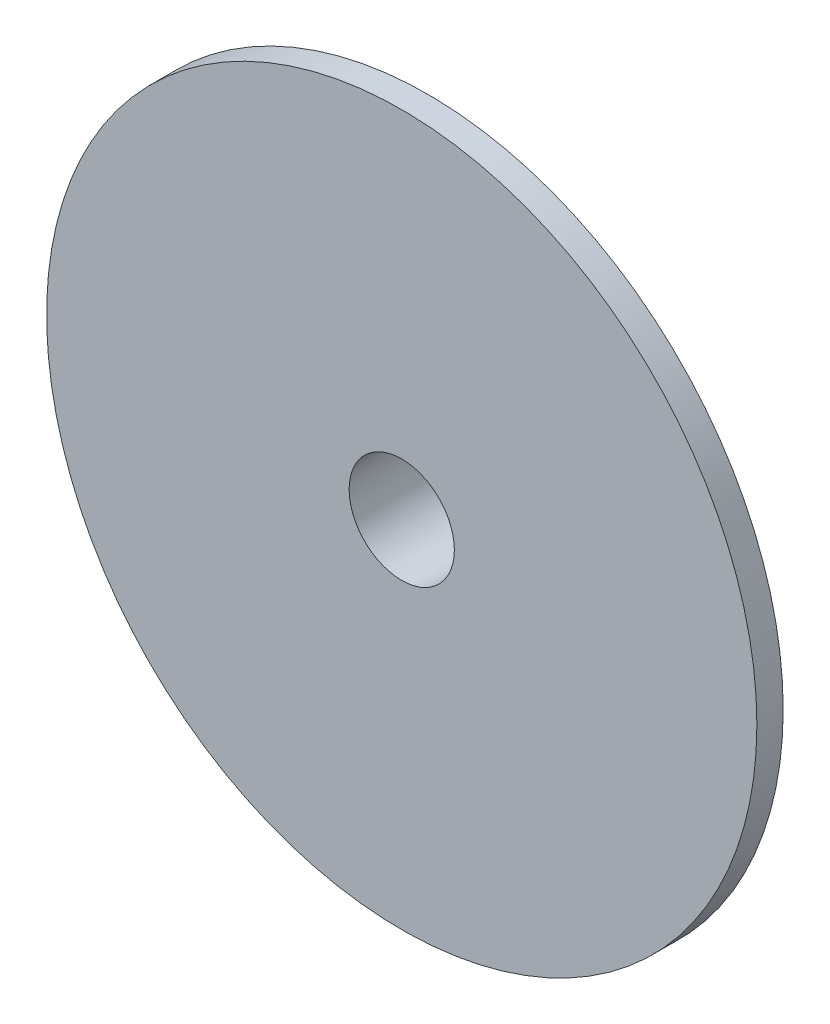
ISO-10303-21;
HEADER;
FILE_DESCRIPTION(('STEP AP214'),'2;1');
FILE_NAME('part.step','',(''),(''),'','','');
FILE_SCHEMA(('AUTOMOTIVE_DESIGN { 1 0 10303 214 1 1 1 1 }'));
ENDSEC;
DATA;
#1=APPLICATION_CONTEXT('core data for automotive mechanical design processes');
#2=APPLICATION_PROTOCOL_DEFINITION('international standard','automotive_design',2000,#1);
#3=PRODUCT_CONTEXT('',#1,'mechanical');
#4=PRODUCT('Part','Part','',(#3));
#5=PRODUCT_RELATED_PRODUCT_CATEGORY('part','',(#4));
#6=PRODUCT_DEFINITION_FORMATION('','',#4);
#7=PRODUCT_DEFINITION_CONTEXT('part definition',#1,'design');
#8=PRODUCT_DEFINITION('design','',#6,#7);
#9=PRODUCT_DEFINITION_SHAPE('','',#8);
#10=(LENGTH_UNIT() NAMED_UNIT(*) SI_UNIT(.MILLI.,.METRE.));
#11=(NAMED_UNIT(*) PLANE_ANGLE_UNIT() SI_UNIT($,.RADIAN.));
#12=(NAMED_UNIT(*) SI_UNIT($,.STERADIAN.) SOLID_ANGLE_UNIT());
#13=UNCERTAINTY_MEASURE_WITH_UNIT(LENGTH_MEASURE(1.E-05),#10,'distance_accuracy_value','');
#14=(GEOMETRIC_REPRESENTATION_CONTEXT(3) GLOBAL_UNCERTAINTY_ASSIGNED_CONTEXT((#13)) GLOBAL_UNIT_ASSIGNED_CONTEXT((#10,
#11,#12)) REPRESENTATION_CONTEXT('',''));
#15=CARTESIAN_POINT('',(0.,0.,0.));
#16=DIRECTION('',(0.,0.,1.));
#17=DIRECTION('',(1.,0.,0.));
#18=AXIS2_PLACEMENT_3D('',#15,#16,#17);
#19=CARTESIAN_POINT('',(0.,0.,2.));
#20=DIRECTION('',(0.,0.,-1.));
#21=DIRECTION('',(-1.,0.,0.));
#22=AXIS2_PLACEMENT_3D('',#19,#20,#21);
#23=CYLINDRICAL_SURFACE('',#22,27.);
#24=CARTESIAN_POINT('',(0.,0.,2.));
#25=DIRECTION('',(0.,0.,1.));
#26=DIRECTION('',(1.,0.,0.));
#27=AXIS2_PLACEMENT_3D('',#24,#25,#26);
#28=CIRCLE('',#27,27.);
#29=CARTESIAN_POINT('',(27.,0.,2.));
#30=VERTEX_POINT('',#29);
#31=EDGE_CURVE('E10',#30,#30,#28,.T.);
#32=ORIENTED_EDGE('',*,*,#31,.F.);
#33=EDGE_LOOP('',(#32));
#34=FACE_BOUND('',#33,.T.);
#35=CARTESIAN_POINT('',(0.,0.,0.));
#36=DIRECTION('',(0.,0.,1.));
#37=DIRECTION('',(1.,0.,0.));
#38=AXIS2_PLACEMENT_3D('',#35,#36,#37);
#39=CIRCLE('',#38,27.);
#40=CARTESIAN_POINT('',(27.,0.,0.));
#41=VERTEX_POINT('',#40);
#42=EDGE_CURVE('E35',#41,#41,#39,.T.);
#43=ORIENTED_EDGE('',*,*,#42,.T.);
#44=EDGE_LOOP('',(#43));
#45=FACE_BOUND('',#44,.T.);
#46=ADVANCED_FACE('F32',(#34,#45),#23,.T.);
#47=CARTESIAN_POINT('',(0.,0.,2.));
#48=DIRECTION('',(0.,0.,1.));
#49=DIRECTION('',(1.,0.,0.));
#50=AXIS2_PLACEMENT_3D('',#47,#48,#49);
#51=PLANE('',#50);
#52=CARTESIAN_POINT('',(0.,0.,2.));
#53=DIRECTION('',(0.,0.,1.));
#54=DIRECTION('',(1.,0.,0.));
#55=AXIS2_PLACEMENT_3D('',#52,#53,#54);
#56=CIRCLE('',#55,4.);
#57=CARTESIAN_POINT('',(4.,0.,2.));
#58=VERTEX_POINT('',#57);
#59=EDGE_CURVE('E47',#58,#58,#56,.T.);
#60=ORIENTED_EDGE('',*,*,#59,.F.);
#61=EDGE_LOOP('',(#60));
#62=FACE_BOUND('',#61,.T.);
#63=ORIENTED_EDGE('',*,*,#31,.T.);
#64=EDGE_LOOP('',(#63));
#65=FACE_BOUND('',#64,.T.);
#66=ADVANCED_FACE('F73',(#62,#65),#51,.T.);
#67=CARTESIAN_POINT('',(0.,0.,0.));
#68=DIRECTION('',(0.,0.,1.));
#69=DIRECTION('',(1.,0.,0.));
#70=AXIS2_PLACEMENT_3D('',#67,#68,#69);
#71=PLANE('',#70);
#72=CARTESIAN_POINT('',(0.,0.,0.));
#73=DIRECTION('',(0.,0.,1.));
#74=DIRECTION('',(1.,0.,0.));
#75=AXIS2_PLACEMENT_3D('',#72,#73,#74);
#76=CIRCLE('',#75,5.5);
#77=CARTESIAN_POINT('',(5.5,0.,0.));
#78=VERTEX_POINT('',#77);
#79=EDGE_CURVE('E44',#78,#78,#76,.T.);
#80=ORIENTED_EDGE('',*,*,#79,.T.);
#81=EDGE_LOOP('',(#80));
#82=FACE_BOUND('',#81,.T.);
#83=ORIENTED_EDGE('',*,*,#42,.F.);
#84=EDGE_LOOP('',(#83));
#85=FACE_BOUND('',#84,.T.);
#86=ADVANCED_FACE('F67',(#82,#85),#71,.F.);
#87=CARTESIAN_POINT('',(0.,0.,-15.));
#88=DIRECTION('',(0.,0.,1.));
#89=DIRECTION('',(1.,0.,0.));
#90=AXIS2_PLACEMENT_3D('',#87,#88,#89);
#91=CYLINDRICAL_SURFACE('',#90,5.5);
#92=CARTESIAN_POINT('',(0.,0.,-15.));
#93=DIRECTION('',(0.,0.,1.));
#94=DIRECTION('',(1.,0.,0.));
#95=AXIS2_PLACEMENT_3D('',#92,#93,#94);
#96=CIRCLE('',#95,5.5);
#97=CARTESIAN_POINT('',(5.5,0.,-15.));
#98=VERTEX_POINT('',#97);
#99=EDGE_CURVE('E42',#98,#98,#96,.T.);
#100=ORIENTED_EDGE('',*,*,#99,.T.);
#101=EDGE_LOOP('',(#100));
#102=FACE_BOUND('',#101,.T.);
#103=ORIENTED_EDGE('',*,*,#79,.F.);
#104=EDGE_LOOP('',(#103));
#105=FACE_BOUND('',#104,.T.);
#106=ADVANCED_FACE('F61',(#102,#105),#91,.T.);
#107=CARTESIAN_POINT('',(0.,0.,-15.));
#108=DIRECTION('',(0.,0.,1.));
#109=DIRECTION('',(1.,0.,0.));
#110=AXIS2_PLACEMENT_3D('',#107,#108,#109);
#111=PLANE('',#110);
#112=CARTESIAN_POINT('',(0.,0.,-15.));
#113=DIRECTION('',(0.,0.,-1.));
#114=DIRECTION('',(-1.,0.,0.));
#115=AXIS2_PLACEMENT_3D('',#112,#113,#114);
#116=CIRCLE('',#115,4.);
#117=CARTESIAN_POINT('',(-4.,0.,-15.));
#118=VERTEX_POINT('',#117);
#119=EDGE_CURVE('E52',#118,#118,#116,.T.);
#120=ORIENTED_EDGE('',*,*,#119,.F.);
#121=EDGE_LOOP('',(#120));
#122=FACE_BOUND('',#121,.T.);
#123=ORIENTED_EDGE('',*,*,#99,.F.);
#124=EDGE_LOOP('',(#123));
#125=FACE_BOUND('',#124,.T.);
#126=ADVANCED_FACE('F58',(#122,#125),#111,.F.);
#127=CARTESIAN_POINT('',(0.,0.,135.));
#128=DIRECTION('',(0.,0.,-1.));
#129=DIRECTION('',(-1.,0.,0.));
#130=AXIS2_PLACEMENT_3D('',#127,#128,#129);
#131=CYLINDRICAL_SURFACE('',#130,4.);
#132=ORIENTED_EDGE('',*,*,#59,.T.);
#133=EDGE_LOOP('',(#132));
#134=FACE_BOUND('',#133,.T.);
#135=ORIENTED_EDGE('',*,*,#119,.T.);
#136=EDGE_LOOP('',(#135));
#137=FACE_BOUND('',#136,.T.);
#138=ADVANCED_FACE('F56',(#134,#137),#131,.F.);
#139=CLOSED_SHELL('',(#46,#66,#86,#106,#126,#138));
#140=MANIFOLD_SOLID_BREP('B2',#139);
#141=ADVANCED_BREP_SHAPE_REPRESENTATION('',(#18,#140),#14);
#142=SHAPE_DEFINITION_REPRESENTATION(#9,#141);
ENDSEC;
END-ISO-10303-21;
